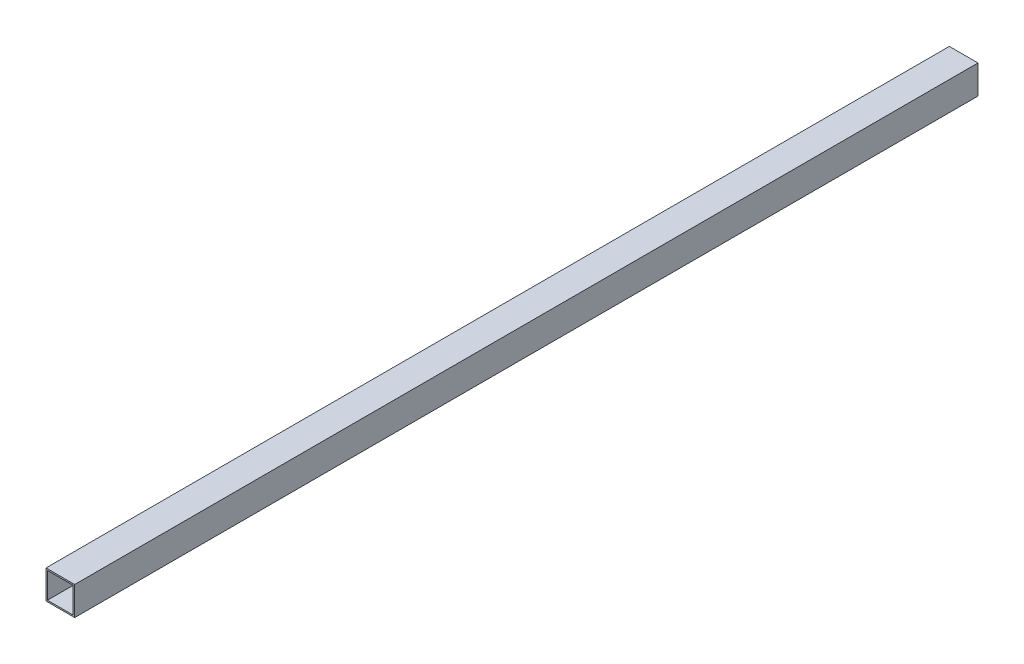
ISO-10303-21;
HEADER;
FILE_DESCRIPTION(('STEP AP214'),'2;1');
FILE_NAME('part.step','',(''),(''),'','','');
FILE_SCHEMA(('AUTOMOTIVE_DESIGN { 1 0 10303 214 1 1 1 1 }'));
ENDSEC;
DATA;
#1=APPLICATION_CONTEXT('core data for automotive mechanical design processes');
#2=APPLICATION_PROTOCOL_DEFINITION('international standard','automotive_design',2000,#1);
#3=PRODUCT_CONTEXT('',#1,'mechanical');
#4=PRODUCT('Part','Part','',(#3));
#5=PRODUCT_RELATED_PRODUCT_CATEGORY('part','',(#4));
#6=PRODUCT_DEFINITION_FORMATION('','',#4);
#7=PRODUCT_DEFINITION_CONTEXT('part definition',#1,'design');
#8=PRODUCT_DEFINITION('design','',#6,#7);
#9=PRODUCT_DEFINITION_SHAPE('','',#8);
#10=(LENGTH_UNIT() NAMED_UNIT(*) SI_UNIT(.MILLI.,.METRE.));
#11=(NAMED_UNIT(*) PLANE_ANGLE_UNIT() SI_UNIT($,.RADIAN.));
#12=(NAMED_UNIT(*) SI_UNIT($,.STERADIAN.) SOLID_ANGLE_UNIT());
#13=UNCERTAINTY_MEASURE_WITH_UNIT(LENGTH_MEASURE(1.E-05),#10,'distance_accuracy_value','');
#14=(GEOMETRIC_REPRESENTATION_CONTEXT(3) GLOBAL_UNCERTAINTY_ASSIGNED_CONTEXT((#13)) GLOBAL_UNIT_ASSIGNED_CONTEXT((#10,
#11,#12)) REPRESENTATION_CONTEXT('',''));
#15=CARTESIAN_POINT('',(0.,0.,0.));
#16=DIRECTION('',(0.,0.,1.));
#17=DIRECTION('',(1.,0.,0.));
#18=AXIS2_PLACEMENT_3D('',#15,#16,#17);
#19=CARTESIAN_POINT('',(0.,0.,1000.));
#20=DIRECTION('',(0.,0.,1.));
#21=DIRECTION('',(1.,0.,0.));
#22=AXIS2_PLACEMENT_3D('',#19,#20,#21);
#23=PLANE('',#22);
#24=DIRECTION('',(0.,1.,0.));
#25=VECTOR('',#24,1.);
#26=CARTESIAN_POINT('',(15.875,15.875,1000.));
#27=LINE('',#26,#25);
#28=CARTESIAN_POINT('',(15.875,-15.875,1000.));
#29=VERTEX_POINT('',#28);
#30=CARTESIAN_POINT('',(15.875,15.875,1000.));
#31=VERTEX_POINT('',#30);
#32=EDGE_CURVE('E134',#29,#31,#27,.T.);
#33=ORIENTED_EDGE('',*,*,#32,.T.);
#34=DIRECTION('',(-1.,0.,0.));
#35=VECTOR('',#34,1.);
#36=CARTESIAN_POINT('',(-15.875,15.875,1000.));
#37=LINE('',#36,#35);
#38=CARTESIAN_POINT('',(-15.875,15.875,1000.));
#39=VERTEX_POINT('',#38);
#40=EDGE_CURVE('E137',#31,#39,#37,.T.);
#41=ORIENTED_EDGE('',*,*,#40,.T.);
#42=DIRECTION('',(0.,-1.,0.));
#43=VECTOR('',#42,1.);
#44=CARTESIAN_POINT('',(-15.875,15.875,1000.));
#45=LINE('',#44,#43);
#46=CARTESIAN_POINT('',(-15.875,-15.875,1000.));
#47=VERTEX_POINT('',#46);
#48=EDGE_CURVE('E140',#39,#47,#45,.T.);
#49=ORIENTED_EDGE('',*,*,#48,.T.);
#50=DIRECTION('',(1.,0.,0.));
#51=VECTOR('',#50,1.);
#52=CARTESIAN_POINT('',(-15.875,-15.875,1000.));
#53=LINE('',#52,#51);
#54=EDGE_CURVE('E142',#47,#29,#53,.T.);
#55=ORIENTED_EDGE('',*,*,#54,.T.);
#56=EDGE_LOOP('',(#33,#41,#49,#55));
#57=FACE_BOUND('',#56,.T.);
#58=DIRECTION('',(-1.,0.,0.));
#59=VECTOR('',#58,1.);
#60=CARTESIAN_POINT('',(-14.2875,14.2875,1000.));
#61=LINE('',#60,#59);
#62=CARTESIAN_POINT('',(14.2875,14.2875,1000.));
#63=VERTEX_POINT('',#62);
#64=CARTESIAN_POINT('',(-14.2875,14.2875,1000.));
#65=VERTEX_POINT('',#64);
#66=EDGE_CURVE('E106',#63,#65,#61,.T.);
#67=ORIENTED_EDGE('',*,*,#66,.F.);
#68=DIRECTION('',(0.,1.,0.));
#69=VECTOR('',#68,1.);
#70=CARTESIAN_POINT('',(14.2875,14.2875,1000.));
#71=LINE('',#70,#69);
#72=CARTESIAN_POINT('',(14.2875,-14.2875,1000.));
#73=VERTEX_POINT('',#72);
#74=EDGE_CURVE('E98',#73,#63,#71,.T.);
#75=ORIENTED_EDGE('',*,*,#74,.F.);
#76=DIRECTION('',(1.,0.,0.));
#77=VECTOR('',#76,1.);
#78=CARTESIAN_POINT('',(-14.2875,-14.2875,1000.));
#79=LINE('',#78,#77);
#80=CARTESIAN_POINT('',(-14.2875,-14.2875,1000.));
#81=VERTEX_POINT('',#80);
#82=EDGE_CURVE('E120',#81,#73,#79,.T.);
#83=ORIENTED_EDGE('',*,*,#82,.F.);
#84=DIRECTION('',(0.,-1.,0.));
#85=VECTOR('',#84,1.);
#86=CARTESIAN_POINT('',(-14.2875,14.2875,1000.));
#87=LINE('',#86,#85);
#88=EDGE_CURVE('E118',#65,#81,#87,.T.);
#89=ORIENTED_EDGE('',*,*,#88,.F.);
#90=EDGE_LOOP('',(#67,#75,#83,#89));
#91=FACE_BOUND('',#90,.T.);
#92=ADVANCED_FACE('F33',(#57,#91),#23,.T.);
#93=CARTESIAN_POINT('',(0.,0.,0.));
#94=DIRECTION('',(0.,0.,1.));
#95=DIRECTION('',(1.,0.,0.));
#96=AXIS2_PLACEMENT_3D('',#93,#94,#95);
#97=PLANE('',#96);
#98=DIRECTION('',(0.,1.,0.));
#99=VECTOR('',#98,1.);
#100=CARTESIAN_POINT('',(15.875,15.875,0.));
#101=LINE('',#100,#99);
#102=CARTESIAN_POINT('',(15.875,-15.875,0.));
#103=VERTEX_POINT('',#102);
#104=CARTESIAN_POINT('',(15.875,15.875,0.));
#105=VERTEX_POINT('',#104);
#106=EDGE_CURVE('E114',#103,#105,#101,.T.);
#107=ORIENTED_EDGE('',*,*,#106,.F.);
#108=DIRECTION('',(1.,0.,0.));
#109=VECTOR('',#108,1.);
#110=CARTESIAN_POINT('',(-15.875,-15.875,0.));
#111=LINE('',#110,#109);
#112=CARTESIAN_POINT('',(-15.875,-15.875,0.));
#113=VERTEX_POINT('',#112);
#114=EDGE_CURVE('E138',#113,#103,#111,.T.);
#115=ORIENTED_EDGE('',*,*,#114,.F.);
#116=DIRECTION('',(0.,-1.,0.));
#117=VECTOR('',#116,1.);
#118=CARTESIAN_POINT('',(-15.875,15.875,0.));
#119=LINE('',#118,#117);
#120=CARTESIAN_POINT('',(-15.875,15.875,0.));
#121=VERTEX_POINT('',#120);
#122=EDGE_CURVE('E149',#121,#113,#119,.T.);
#123=ORIENTED_EDGE('',*,*,#122,.F.);
#124=DIRECTION('',(-1.,0.,0.));
#125=VECTOR('',#124,1.);
#126=CARTESIAN_POINT('',(-15.875,15.875,0.));
#127=LINE('',#126,#125);
#128=EDGE_CURVE('E147',#105,#121,#127,.T.);
#129=ORIENTED_EDGE('',*,*,#128,.F.);
#130=EDGE_LOOP('',(#107,#115,#123,#129));
#131=FACE_BOUND('',#130,.T.);
#132=DIRECTION('',(0.,1.,0.));
#133=VECTOR('',#132,1.);
#134=CARTESIAN_POINT('',(14.2875,14.2875,0.));
#135=LINE('',#134,#133);
#136=CARTESIAN_POINT('',(14.2875,-14.2875,0.));
#137=VERTEX_POINT('',#136);
#138=CARTESIAN_POINT('',(14.2875,14.2875,0.));
#139=VERTEX_POINT('',#138);
#140=EDGE_CURVE('E56',#137,#139,#135,.T.);
#141=ORIENTED_EDGE('',*,*,#140,.T.);
#142=DIRECTION('',(-1.,0.,0.));
#143=VECTOR('',#142,1.);
#144=CARTESIAN_POINT('',(-14.2875,14.2875,0.));
#145=LINE('',#144,#143);
#146=CARTESIAN_POINT('',(-14.2875,14.2875,0.));
#147=VERTEX_POINT('',#146);
#148=EDGE_CURVE('E113',#139,#147,#145,.T.);
#149=ORIENTED_EDGE('',*,*,#148,.T.);
#150=DIRECTION('',(0.,-1.,0.));
#151=VECTOR('',#150,1.);
#152=CARTESIAN_POINT('',(-14.2875,14.2875,0.));
#153=LINE('',#152,#151);
#154=CARTESIAN_POINT('',(-14.2875,-14.2875,0.));
#155=VERTEX_POINT('',#154);
#156=EDGE_CURVE('E126',#147,#155,#153,.T.);
#157=ORIENTED_EDGE('',*,*,#156,.T.);
#158=DIRECTION('',(1.,0.,0.));
#159=VECTOR('',#158,1.);
#160=CARTESIAN_POINT('',(-14.2875,-14.2875,0.));
#161=LINE('',#160,#159);
#162=EDGE_CURVE('E107',#155,#137,#161,.T.);
#163=ORIENTED_EDGE('',*,*,#162,.T.);
#164=EDGE_LOOP('',(#141,#149,#157,#163));
#165=FACE_BOUND('',#164,.T.);
#166=ADVANCED_FACE('F167',(#131,#165),#97,.F.);
#167=CARTESIAN_POINT('',(15.875,15.875,1000.));
#168=DIRECTION('',(-1.,0.,0.));
#169=DIRECTION('',(0.,-1.,0.));
#170=AXIS2_PLACEMENT_3D('',#167,#168,#169);
#171=PLANE('',#170);
#172=ORIENTED_EDGE('',*,*,#106,.T.);
#173=DIRECTION('',(0.,0.,-1.));
#174=VECTOR('',#173,1.);
#175=CARTESIAN_POINT('',(15.875,15.875,1000.));
#176=LINE('',#175,#174);
#177=EDGE_CURVE('E11',#31,#105,#176,.T.);
#178=ORIENTED_EDGE('',*,*,#177,.F.);
#179=ORIENTED_EDGE('',*,*,#32,.F.);
#180=DIRECTION('',(0.,0.,-1.));
#181=VECTOR('',#180,1.);
#182=CARTESIAN_POINT('',(15.875,-15.875,1000.));
#183=LINE('',#182,#181);
#184=EDGE_CURVE('E144',#29,#103,#183,.T.);
#185=ORIENTED_EDGE('',*,*,#184,.T.);
#186=EDGE_LOOP('',(#172,#178,#179,#185));
#187=FACE_BOUND('',#186,.T.);
#188=ADVANCED_FACE('F35',(#187),#171,.F.);
#189=CARTESIAN_POINT('',(-15.875,15.875,1000.));
#190=DIRECTION('',(0.,-1.,0.));
#191=DIRECTION('',(0.,0.,-1.));
#192=AXIS2_PLACEMENT_3D('',#189,#190,#191);
#193=PLANE('',#192);
#194=ORIENTED_EDGE('',*,*,#128,.T.);
#195=DIRECTION('',(0.,0.,-1.));
#196=VECTOR('',#195,1.);
#197=CARTESIAN_POINT('',(-15.875,15.875,1000.));
#198=LINE('',#197,#196);
#199=EDGE_CURVE('E41',#39,#121,#198,.T.);
#200=ORIENTED_EDGE('',*,*,#199,.F.);
#201=ORIENTED_EDGE('',*,*,#40,.F.);
#202=ORIENTED_EDGE('',*,*,#177,.T.);
#203=EDGE_LOOP('',(#194,#200,#201,#202));
#204=FACE_BOUND('',#203,.T.);
#205=ADVANCED_FACE('F177',(#204),#193,.F.);
#206=CARTESIAN_POINT('',(-15.875,15.875,1000.));
#207=DIRECTION('',(1.,0.,0.));
#208=DIRECTION('',(0.,0.,-1.));
#209=AXIS2_PLACEMENT_3D('',#206,#207,#208);
#210=PLANE('',#209);
#211=ORIENTED_EDGE('',*,*,#122,.T.);
#212=DIRECTION('',(0.,0.,-1.));
#213=VECTOR('',#212,1.);
#214=CARTESIAN_POINT('',(-15.875,-15.875,1000.));
#215=LINE('',#214,#213);
#216=EDGE_CURVE('E154',#47,#113,#215,.T.);
#217=ORIENTED_EDGE('',*,*,#216,.F.);
#218=ORIENTED_EDGE('',*,*,#48,.F.);
#219=ORIENTED_EDGE('',*,*,#199,.T.);
#220=EDGE_LOOP('',(#211,#217,#218,#219));
#221=FACE_BOUND('',#220,.T.);
#222=ADVANCED_FACE('F161',(#221),#210,.F.);
#223=CARTESIAN_POINT('',(-15.875,-15.875,1000.));
#224=DIRECTION('',(0.,1.,0.));
#225=DIRECTION('',(0.,0.,1.));
#226=AXIS2_PLACEMENT_3D('',#223,#224,#225);
#227=PLANE('',#226);
#228=ORIENTED_EDGE('',*,*,#114,.T.);
#229=ORIENTED_EDGE('',*,*,#184,.F.);
#230=ORIENTED_EDGE('',*,*,#54,.F.);
#231=ORIENTED_EDGE('',*,*,#216,.T.);
#232=EDGE_LOOP('',(#228,#229,#230,#231));
#233=FACE_BOUND('',#232,.T.);
#234=ADVANCED_FACE('F171',(#233),#227,.F.);
#235=CARTESIAN_POINT('',(14.2875,14.2875,1000.));
#236=DIRECTION('',(-1.,0.,0.));
#237=DIRECTION('',(0.,0.,1.));
#238=AXIS2_PLACEMENT_3D('',#235,#236,#237);
#239=PLANE('',#238);
#240=ORIENTED_EDGE('',*,*,#140,.F.);
#241=DIRECTION('',(0.,0.,-1.));
#242=VECTOR('',#241,1.);
#243=CARTESIAN_POINT('',(14.2875,-14.2875,1000.));
#244=LINE('',#243,#242);
#245=EDGE_CURVE('E102',#73,#137,#244,.T.);
#246=ORIENTED_EDGE('',*,*,#245,.F.);
#247=ORIENTED_EDGE('',*,*,#74,.T.);
#248=DIRECTION('',(0.,0.,-1.));
#249=VECTOR('',#248,1.);
#250=CARTESIAN_POINT('',(14.2875,14.2875,1000.));
#251=LINE('',#250,#249);
#252=EDGE_CURVE('E101',#63,#139,#251,.T.);
#253=ORIENTED_EDGE('',*,*,#252,.T.);
#254=EDGE_LOOP('',(#240,#246,#247,#253));
#255=FACE_BOUND('',#254,.T.);
#256=ADVANCED_FACE('F100',(#255),#239,.T.);
#257=CARTESIAN_POINT('',(-14.2875,14.2875,1000.));
#258=DIRECTION('',(0.,-1.,0.));
#259=DIRECTION('',(0.,0.,-1.));
#260=AXIS2_PLACEMENT_3D('',#257,#258,#259);
#261=PLANE('',#260);
#262=ORIENTED_EDGE('',*,*,#148,.F.);
#263=ORIENTED_EDGE('',*,*,#252,.F.);
#264=ORIENTED_EDGE('',*,*,#66,.T.);
#265=DIRECTION('',(0.,0.,-1.));
#266=VECTOR('',#265,1.);
#267=CARTESIAN_POINT('',(-14.2875,14.2875,1000.));
#268=LINE('',#267,#266);
#269=EDGE_CURVE('E115',#65,#147,#268,.T.);
#270=ORIENTED_EDGE('',*,*,#269,.T.);
#271=EDGE_LOOP('',(#262,#263,#264,#270));
#272=FACE_BOUND('',#271,.T.);
#273=ADVANCED_FACE('F110',(#272),#261,.T.);
#274=CARTESIAN_POINT('',(-14.2875,14.2875,1000.));
#275=DIRECTION('',(1.,0.,0.));
#276=DIRECTION('',(0.,0.,-1.));
#277=AXIS2_PLACEMENT_3D('',#274,#275,#276);
#278=PLANE('',#277);
#279=ORIENTED_EDGE('',*,*,#156,.F.);
#280=ORIENTED_EDGE('',*,*,#269,.F.);
#281=ORIENTED_EDGE('',*,*,#88,.T.);
#282=DIRECTION('',(0.,0.,-1.));
#283=VECTOR('',#282,1.);
#284=CARTESIAN_POINT('',(-14.2875,-14.2875,1000.));
#285=LINE('',#284,#283);
#286=EDGE_CURVE('E48',#81,#155,#285,.T.);
#287=ORIENTED_EDGE('',*,*,#286,.T.);
#288=EDGE_LOOP('',(#279,#280,#281,#287));
#289=FACE_BOUND('',#288,.T.);
#290=ADVANCED_FACE('F200',(#289),#278,.T.);
#291=CARTESIAN_POINT('',(-14.2875,-14.2875,1000.));
#292=DIRECTION('',(0.,1.,0.));
#293=DIRECTION('',(0.,0.,1.));
#294=AXIS2_PLACEMENT_3D('',#291,#292,#293);
#295=PLANE('',#294);
#296=ORIENTED_EDGE('',*,*,#162,.F.);
#297=ORIENTED_EDGE('',*,*,#286,.F.);
#298=ORIENTED_EDGE('',*,*,#82,.T.);
#299=ORIENTED_EDGE('',*,*,#245,.T.);
#300=EDGE_LOOP('',(#296,#297,#298,#299));
#301=FACE_BOUND('',#300,.T.);
#302=ADVANCED_FACE('F204',(#301),#295,.T.);
#303=CLOSED_SHELL('',(#92,#166,#188,#205,#222,#234,#256,#273,#290,#302));
#304=MANIFOLD_SOLID_BREP('B2',#303);
#305=ADVANCED_BREP_SHAPE_REPRESENTATION('',(#18,#304),#14);
#306=SHAPE_DEFINITION_REPRESENTATION(#9,#305);
ENDSEC;
END-ISO-10303-21;
